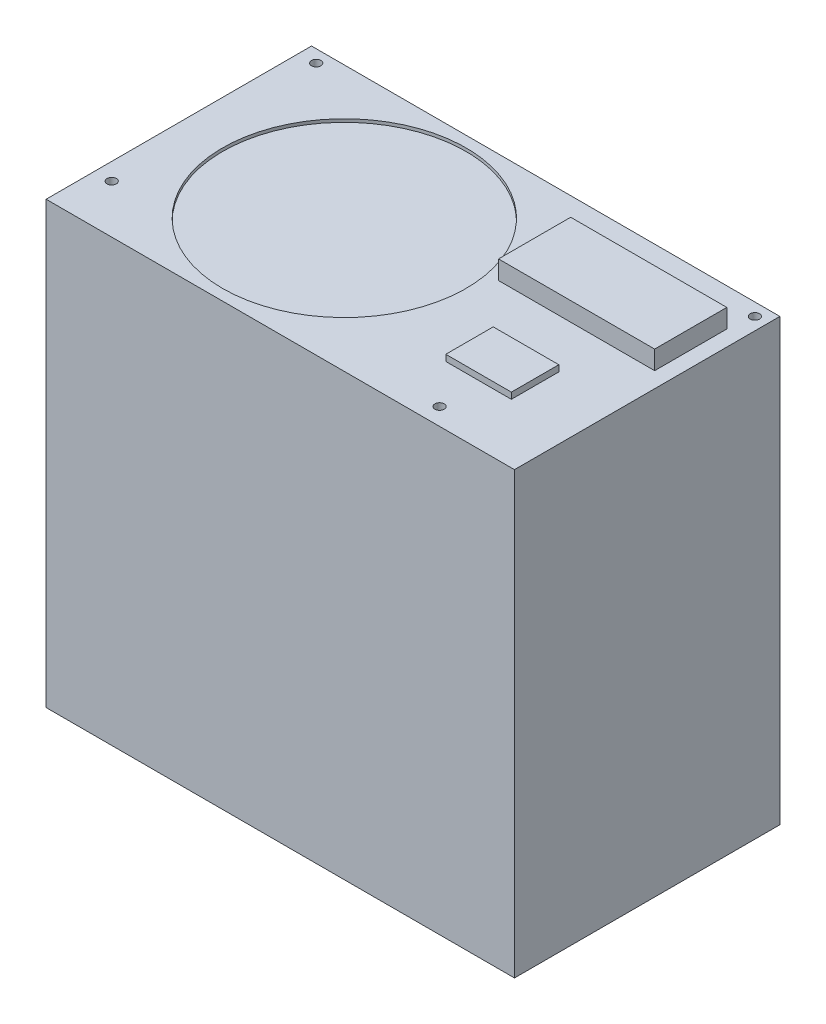
ISO-10303-21;
HEADER;
FILE_DESCRIPTION(('STEP AP214'),'2;1');
FILE_NAME('part.step','',(''),(''),'','','');
FILE_SCHEMA(('AUTOMOTIVE_DESIGN { 1 0 10303 214 1 1 1 1 }'));
ENDSEC;
DATA;
#1=APPLICATION_CONTEXT('core data for automotive mechanical design processes');
#2=APPLICATION_PROTOCOL_DEFINITION('international standard','automotive_design',2000,#1);
#3=PRODUCT_CONTEXT('',#1,'mechanical');
#4=PRODUCT('Part','Part','',(#3));
#5=PRODUCT_RELATED_PRODUCT_CATEGORY('part','',(#4));
#6=PRODUCT_DEFINITION_FORMATION('','',#4);
#7=PRODUCT_DEFINITION_CONTEXT('part definition',#1,'design');
#8=PRODUCT_DEFINITION('design','',#6,#7);
#9=PRODUCT_DEFINITION_SHAPE('','',#8);
#10=(LENGTH_UNIT() NAMED_UNIT(*) SI_UNIT(.MILLI.,.METRE.));
#11=(NAMED_UNIT(*) PLANE_ANGLE_UNIT() SI_UNIT($,.RADIAN.));
#12=(NAMED_UNIT(*) SI_UNIT($,.STERADIAN.) SOLID_ANGLE_UNIT());
#13=UNCERTAINTY_MEASURE_WITH_UNIT(LENGTH_MEASURE(1.E-05),#10,'distance_accuracy_value','');
#14=(GEOMETRIC_REPRESENTATION_CONTEXT(3) GLOBAL_UNCERTAINTY_ASSIGNED_CONTEXT((#13)) GLOBAL_UNIT_ASSIGNED_CONTEXT((#10,
#11,#12)) REPRESENTATION_CONTEXT('',''));
#15=CARTESIAN_POINT('',(0.,0.,0.));
#16=DIRECTION('',(0.,0.,1.));
#17=DIRECTION('',(1.,0.,0.));
#18=AXIS2_PLACEMENT_3D('',#15,#16,#17);
#19=CARTESIAN_POINT('',(0.,141.,85.));
#20=DIRECTION('',(0.,-1.,0.));
#21=DIRECTION('',(0.,0.,-1.));
#22=AXIS2_PLACEMENT_3D('',#19,#20,#21);
#23=PLANE('',#22);
#24=CARTESIAN_POINT('',(120.5,141.,79.5));
#25=DIRECTION('',(0.,1.,0.));
#26=DIRECTION('',(0.,0.,1.));
#27=AXIS2_PLACEMENT_3D('',#24,#25,#26);
#28=CIRCLE('',#27,1.5);
#29=CARTESIAN_POINT('',(120.5,141.,81.));
#30=VERTEX_POINT('',#29);
#31=EDGE_CURVE('E248',#30,#30,#28,.T.);
#32=ORIENTED_EDGE('',*,*,#31,.F.);
#33=EDGE_LOOP('',(#32));
#34=FACE_BOUND('',#33,.T.);
#35=CARTESIAN_POINT('',(5.50000000000001,141.,69.5));
#36=DIRECTION('',(0.,1.,0.));
#37=DIRECTION('',(0.,0.,1.));
#38=AXIS2_PLACEMENT_3D('',#35,#36,#37);
#39=CIRCLE('',#38,1.5);
#40=CARTESIAN_POINT('',(5.50000000000001,141.,71.));
#41=VERTEX_POINT('',#40);
#42=EDGE_CURVE('E242',#41,#41,#39,.T.);
#43=ORIENTED_EDGE('',*,*,#42,.F.);
#44=EDGE_LOOP('',(#43));
#45=FACE_BOUND('',#44,.T.);
#46=CARTESIAN_POINT('',(5.50000000000001,141.,4.));
#47=DIRECTION('',(0.,1.,0.));
#48=DIRECTION('',(0.,0.,1.));
#49=AXIS2_PLACEMENT_3D('',#46,#47,#48);
#50=CIRCLE('',#49,1.5);
#51=CARTESIAN_POINT('',(5.50000000000001,141.,5.5));
#52=VERTEX_POINT('',#51);
#53=EDGE_CURVE('E236',#52,#52,#50,.T.);
#54=ORIENTED_EDGE('',*,*,#53,.F.);
#55=EDGE_LOOP('',(#54));
#56=FACE_BOUND('',#55,.T.);
#57=CARTESIAN_POINT('',(146.,141.,4.));
#58=DIRECTION('',(0.,1.,0.));
#59=DIRECTION('',(0.,0.,1.));
#60=AXIS2_PLACEMENT_3D('',#57,#58,#59);
#61=CIRCLE('',#60,1.5);
#62=CARTESIAN_POINT('',(146.,141.,5.5));
#63=VERTEX_POINT('',#62);
#64=EDGE_CURVE('E229',#63,#63,#61,.T.);
#65=ORIENTED_EDGE('',*,*,#64,.F.);
#66=EDGE_LOOP('',(#65));
#67=FACE_BOUND('',#66,.T.);
#68=CARTESIAN_POINT('',(53.,141.,42.5));
#69=DIRECTION('',(0.,1.,0.));
#70=DIRECTION('',(0.,0.,1.));
#71=AXIS2_PLACEMENT_3D('',#68,#69,#70);
#72=CIRCLE('',#71,39.);
#73=CARTESIAN_POINT('',(53.,141.,81.5));
#74=VERTEX_POINT('',#73);
#75=EDGE_CURVE('E223',#74,#74,#72,.T.);
#76=ORIENTED_EDGE('',*,*,#75,.F.);
#77=EDGE_LOOP('',(#76));
#78=FACE_BOUND('',#77,.T.);
#79=DIRECTION('',(0.,0.,-1.));
#80=VECTOR('',#79,1.);
#81=CARTESIAN_POINT('',(130.,141.,66.));
#82=LINE('',#81,#80);
#83=CARTESIAN_POINT('',(130.,141.,66.));
#84=VERTEX_POINT('',#83);
#85=CARTESIAN_POINT('',(130.,141.,50.8));
#86=VERTEX_POINT('',#85);
#87=EDGE_CURVE('E184',#84,#86,#82,.T.);
#88=ORIENTED_EDGE('',*,*,#87,.F.);
#89=DIRECTION('',(1.,0.,0.));
#90=VECTOR('',#89,1.);
#91=CARTESIAN_POINT('',(130.,141.,66.));
#92=LINE('',#91,#90);
#93=CARTESIAN_POINT('',(109.,141.,66.));
#94=VERTEX_POINT('',#93);
#95=EDGE_CURVE('E174',#94,#84,#92,.T.);
#96=ORIENTED_EDGE('',*,*,#95,.F.);
#97=DIRECTION('',(0.,0.,1.));
#98=VECTOR('',#97,1.);
#99=CARTESIAN_POINT('',(109.,141.,66.));
#100=LINE('',#99,#98);
#101=CARTESIAN_POINT('',(109.,141.,50.8));
#102=VERTEX_POINT('',#101);
#103=EDGE_CURVE('E178',#102,#94,#100,.T.);
#104=ORIENTED_EDGE('',*,*,#103,.F.);
#105=DIRECTION('',(-1.,0.,0.));
#106=VECTOR('',#105,1.);
#107=CARTESIAN_POINT('',(130.,141.,50.8));
#108=LINE('',#107,#106);
#109=EDGE_CURVE('E181',#86,#102,#108,.T.);
#110=ORIENTED_EDGE('',*,*,#109,.F.);
#111=EDGE_LOOP('',(#88,#96,#104,#110));
#112=FACE_BOUND('',#111,.T.);
#113=DIRECTION('',(-1.,0.,0.));
#114=VECTOR('',#113,1.);
#115=CARTESIAN_POINT('',(0.,141.,0.));
#116=LINE('',#115,#114);
#117=CARTESIAN_POINT('',(150.,141.,0.));
#118=VERTEX_POINT('',#117);
#119=CARTESIAN_POINT('',(0.,141.,0.));
#120=VERTEX_POINT('',#119);
#121=EDGE_CURVE('E148',#118,#120,#116,.T.);
#122=ORIENTED_EDGE('',*,*,#121,.T.);
#123=DIRECTION('',(0.,0.,-1.));
#124=VECTOR('',#123,1.);
#125=CARTESIAN_POINT('',(0.,141.,85.));
#126=LINE('',#125,#124);
#127=CARTESIAN_POINT('',(0.,141.,85.));
#128=VERTEX_POINT('',#127);
#129=EDGE_CURVE('E143',#128,#120,#126,.T.);
#130=ORIENTED_EDGE('',*,*,#129,.F.);
#131=DIRECTION('',(-1.,0.,0.));
#132=VECTOR('',#131,1.);
#133=CARTESIAN_POINT('',(0.,141.,85.));
#134=LINE('',#133,#132);
#135=CARTESIAN_POINT('',(150.,141.,85.));
#136=VERTEX_POINT('',#135);
#137=EDGE_CURVE('E147',#136,#128,#134,.T.);
#138=ORIENTED_EDGE('',*,*,#137,.F.);
#139=DIRECTION('',(0.,0.,-1.));
#140=VECTOR('',#139,1.);
#141=CARTESIAN_POINT('',(150.,141.,85.));
#142=LINE('',#141,#140);
#143=EDGE_CURVE('E138',#136,#118,#142,.T.);
#144=ORIENTED_EDGE('',*,*,#143,.T.);
#145=EDGE_LOOP('',(#122,#130,#138,#144));
#146=FACE_BOUND('',#145,.T.);
#147=DIRECTION('',(0.,0.,-1.));
#148=VECTOR('',#147,1.);
#149=CARTESIAN_POINT('',(145.,141.,35.11));
#150=LINE('',#149,#148);
#151=CARTESIAN_POINT('',(145.,141.,35.11));
#152=VERTEX_POINT('',#151);
#153=CARTESIAN_POINT('',(145.,141.,12.));
#154=VERTEX_POINT('',#153);
#155=EDGE_CURVE('E212',#152,#154,#150,.T.);
#156=ORIENTED_EDGE('',*,*,#155,.F.);
#157=DIRECTION('',(1.,0.,0.));
#158=VECTOR('',#157,1.);
#159=CARTESIAN_POINT('',(145.,141.,35.11));
#160=LINE('',#159,#158);
#161=CARTESIAN_POINT('',(95.,141.,35.11));
#162=VERTEX_POINT('',#161);
#163=EDGE_CURVE('E206',#162,#152,#160,.T.);
#164=ORIENTED_EDGE('',*,*,#163,.F.);
#165=DIRECTION('',(0.,0.,1.));
#166=VECTOR('',#165,1.);
#167=CARTESIAN_POINT('',(95.,141.,35.11));
#168=LINE('',#167,#166);
#169=CARTESIAN_POINT('',(95.,141.,12.));
#170=VERTEX_POINT('',#169);
#171=EDGE_CURVE('E53',#170,#162,#168,.T.);
#172=ORIENTED_EDGE('',*,*,#171,.F.);
#173=DIRECTION('',(-1.,0.,0.));
#174=VECTOR('',#173,1.);
#175=CARTESIAN_POINT('',(145.,141.,12.));
#176=LINE('',#175,#174);
#177=EDGE_CURVE('E48',#154,#170,#176,.T.);
#178=ORIENTED_EDGE('',*,*,#177,.F.);
#179=EDGE_LOOP('',(#156,#164,#172,#178));
#180=FACE_BOUND('',#179,.T.);
#181=ADVANCED_FACE('F33',(#34,#45,#56,#67,#78,#112,#146,#180),#23,.F.);
#182=CARTESIAN_POINT('',(0.,0.,85.));
#183=DIRECTION('',(1.,0.,0.));
#184=DIRECTION('',(0.,0.,-1.));
#185=AXIS2_PLACEMENT_3D('',#182,#183,#184);
#186=PLANE('',#185);
#187=DIRECTION('',(0.,-1.,0.));
#188=VECTOR('',#187,1.);
#189=CARTESIAN_POINT('',(0.,0.,0.));
#190=LINE('',#189,#188);
#191=CARTESIAN_POINT('',(0.,0.,0.));
#192=VERTEX_POINT('',#191);
#193=EDGE_CURVE('E134',#120,#192,#190,.T.);
#194=ORIENTED_EDGE('',*,*,#193,.T.);
#195=DIRECTION('',(0.,0.,-1.));
#196=VECTOR('',#195,1.);
#197=CARTESIAN_POINT('',(0.,0.,85.));
#198=LINE('',#197,#196);
#199=CARTESIAN_POINT('',(0.,0.,18.5));
#200=VERTEX_POINT('',#199);
#201=EDGE_CURVE('E41',#200,#192,#198,.T.);
#202=ORIENTED_EDGE('',*,*,#201,.F.);
#203=CARTESIAN_POINT('',(0.,0.,85.));
#204=VERTEX_POINT('',#203);
#205=EDGE_CURVE('E11',#204,#200,#198,.T.);
#206=ORIENTED_EDGE('',*,*,#205,.F.);
#207=DIRECTION('',(0.,-1.,0.));
#208=VECTOR('',#207,1.);
#209=CARTESIAN_POINT('',(0.,0.,85.));
#210=LINE('',#209,#208);
#211=EDGE_CURVE('E150',#128,#204,#210,.T.);
#212=ORIENTED_EDGE('',*,*,#211,.F.);
#213=ORIENTED_EDGE('',*,*,#129,.T.);
#214=EDGE_LOOP('',(#194,#202,#206,#212,#213));
#215=FACE_BOUND('',#214,.T.);
#216=ADVANCED_FACE('F35',(#215),#186,.F.);
#217=CARTESIAN_POINT('',(0.,0.,85.));
#218=DIRECTION('',(0.,1.,0.));
#219=DIRECTION('',(0.,0.,1.));
#220=AXIS2_PLACEMENT_3D('',#217,#218,#219);
#221=PLANE('',#220);
#222=ORIENTED_EDGE('',*,*,#205,.T.);
#223=CARTESIAN_POINT('',(12.5,0.,18.5));
#224=DIRECTION('',(0.,-1.,0.));
#225=DIRECTION('',(0.,0.,-1.));
#226=AXIS2_PLACEMENT_3D('',#223,#224,#225);
#227=CIRCLE('',#226,12.5);
#228=EDGE_CURVE('E125',#200,#200,#227,.T.);
#229=ORIENTED_EDGE('',*,*,#228,.F.);
#230=ORIENTED_EDGE('',*,*,#201,.T.);
#231=DIRECTION('',(1.,0.,0.));
#232=VECTOR('',#231,1.);
#233=CARTESIAN_POINT('',(0.,0.,0.));
#234=LINE('',#233,#232);
#235=CARTESIAN_POINT('',(150.,0.,0.));
#236=VERTEX_POINT('',#235);
#237=EDGE_CURVE('E153',#192,#236,#234,.T.);
#238=ORIENTED_EDGE('',*,*,#237,.T.);
#239=DIRECTION('',(0.,0.,-1.));
#240=VECTOR('',#239,1.);
#241=CARTESIAN_POINT('',(150.,0.,85.));
#242=LINE('',#241,#240);
#243=CARTESIAN_POINT('',(150.,0.,85.));
#244=VERTEX_POINT('',#243);
#245=EDGE_CURVE('E136',#244,#236,#242,.T.);
#246=ORIENTED_EDGE('',*,*,#245,.F.);
#247=DIRECTION('',(1.,0.,0.));
#248=VECTOR('',#247,1.);
#249=CARTESIAN_POINT('',(0.,0.,85.));
#250=LINE('',#249,#248);
#251=EDGE_CURVE('E127',#204,#244,#250,.T.);
#252=ORIENTED_EDGE('',*,*,#251,.F.);
#253=EDGE_LOOP('',(#222,#229,#230,#238,#246,#252));
#254=FACE_BOUND('',#253,.T.);
#255=ADVANCED_FACE('F123',(#254),#221,.F.);
#256=CARTESIAN_POINT('',(150.,0.,85.));
#257=DIRECTION('',(-1.,0.,0.));
#258=DIRECTION('',(0.,0.,1.));
#259=AXIS2_PLACEMENT_3D('',#256,#257,#258);
#260=PLANE('',#259);
#261=DIRECTION('',(0.,1.,0.));
#262=VECTOR('',#261,1.);
#263=CARTESIAN_POINT('',(150.,0.,0.));
#264=LINE('',#263,#262);
#265=EDGE_CURVE('E151',#236,#118,#264,.T.);
#266=ORIENTED_EDGE('',*,*,#265,.T.);
#267=ORIENTED_EDGE('',*,*,#143,.F.);
#268=DIRECTION('',(0.,1.,0.));
#269=VECTOR('',#268,1.);
#270=CARTESIAN_POINT('',(150.,0.,85.));
#271=LINE('',#270,#269);
#272=EDGE_CURVE('E158',#244,#136,#271,.T.);
#273=ORIENTED_EDGE('',*,*,#272,.F.);
#274=ORIENTED_EDGE('',*,*,#245,.T.);
#275=EDGE_LOOP('',(#266,#267,#273,#274));
#276=FACE_BOUND('',#275,.T.);
#277=ADVANCED_FACE('F284',(#276),#260,.F.);
#278=CARTESIAN_POINT('',(0.,0.,85.));
#279=DIRECTION('',(0.,0.,-1.));
#280=DIRECTION('',(-1.,0.,0.));
#281=AXIS2_PLACEMENT_3D('',#278,#279,#280);
#282=PLANE('',#281);
#283=ORIENTED_EDGE('',*,*,#211,.T.);
#284=ORIENTED_EDGE('',*,*,#251,.T.);
#285=ORIENTED_EDGE('',*,*,#272,.T.);
#286=ORIENTED_EDGE('',*,*,#137,.T.);
#287=EDGE_LOOP('',(#283,#284,#285,#286));
#288=FACE_BOUND('',#287,.T.);
#289=ADVANCED_FACE('F286',(#288),#282,.F.);
#290=CARTESIAN_POINT('',(0.,0.,0.));
#291=DIRECTION('',(0.,0.,-1.));
#292=DIRECTION('',(-1.,0.,0.));
#293=AXIS2_PLACEMENT_3D('',#290,#291,#292);
#294=PLANE('',#293);
#295=ORIENTED_EDGE('',*,*,#193,.F.);
#296=ORIENTED_EDGE('',*,*,#121,.F.);
#297=ORIENTED_EDGE('',*,*,#265,.F.);
#298=ORIENTED_EDGE('',*,*,#237,.F.);
#299=EDGE_LOOP('',(#295,#296,#297,#298));
#300=FACE_BOUND('',#299,.T.);
#301=ADVANCED_FACE('F282',(#300),#294,.T.);
#302=CARTESIAN_POINT('',(130.,143.,66.));
#303=DIRECTION('',(-1.,0.,0.));
#304=DIRECTION('',(0.,0.,1.));
#305=AXIS2_PLACEMENT_3D('',#302,#303,#304);
#306=PLANE('',#305);
#307=ORIENTED_EDGE('',*,*,#87,.T.);
#308=DIRECTION('',(0.,-1.,0.));
#309=VECTOR('',#308,1.);
#310=CARTESIAN_POINT('',(130.,143.,50.8));
#311=LINE('',#310,#309);
#312=CARTESIAN_POINT('',(130.,143.,50.8));
#313=VERTEX_POINT('',#312);
#314=EDGE_CURVE('E156',#313,#86,#311,.T.);
#315=ORIENTED_EDGE('',*,*,#314,.F.);
#316=DIRECTION('',(0.,0.,-1.));
#317=VECTOR('',#316,1.);
#318=CARTESIAN_POINT('',(130.,143.,66.));
#319=LINE('',#318,#317);
#320=CARTESIAN_POINT('',(130.,143.,66.));
#321=VERTEX_POINT('',#320);
#322=EDGE_CURVE('E177',#321,#313,#319,.T.);
#323=ORIENTED_EDGE('',*,*,#322,.F.);
#324=DIRECTION('',(0.,-1.,0.));
#325=VECTOR('',#324,1.);
#326=CARTESIAN_POINT('',(130.,143.,66.));
#327=LINE('',#326,#325);
#328=EDGE_CURVE('E170',#321,#84,#327,.T.);
#329=ORIENTED_EDGE('',*,*,#328,.T.);
#330=EDGE_LOOP('',(#307,#315,#323,#329));
#331=FACE_BOUND('',#330,.T.);
#332=ADVANCED_FACE('F308',(#331),#306,.F.);
#333=CARTESIAN_POINT('',(130.,143.,50.8));
#334=DIRECTION('',(0.,0.,1.));
#335=DIRECTION('',(1.,0.,0.));
#336=AXIS2_PLACEMENT_3D('',#333,#334,#335);
#337=PLANE('',#336);
#338=ORIENTED_EDGE('',*,*,#109,.T.);
#339=DIRECTION('',(0.,-1.,0.));
#340=VECTOR('',#339,1.);
#341=CARTESIAN_POINT('',(109.,143.,50.8));
#342=LINE('',#341,#340);
#343=CARTESIAN_POINT('',(109.,143.,50.8));
#344=VERTEX_POINT('',#343);
#345=EDGE_CURVE('E164',#344,#102,#342,.T.);
#346=ORIENTED_EDGE('',*,*,#345,.F.);
#347=DIRECTION('',(-1.,0.,0.));
#348=VECTOR('',#347,1.);
#349=CARTESIAN_POINT('',(130.,143.,50.8));
#350=LINE('',#349,#348);
#351=EDGE_CURVE('E191',#313,#344,#350,.T.);
#352=ORIENTED_EDGE('',*,*,#351,.F.);
#353=ORIENTED_EDGE('',*,*,#314,.T.);
#354=EDGE_LOOP('',(#338,#346,#352,#353));
#355=FACE_BOUND('',#354,.T.);
#356=ADVANCED_FACE('F315',(#355),#337,.F.);
#357=CARTESIAN_POINT('',(109.,143.,66.));
#358=DIRECTION('',(1.,0.,0.));
#359=DIRECTION('',(0.,0.,-1.));
#360=AXIS2_PLACEMENT_3D('',#357,#358,#359);
#361=PLANE('',#360);
#362=ORIENTED_EDGE('',*,*,#103,.T.);
#363=DIRECTION('',(0.,-1.,0.));
#364=VECTOR('',#363,1.);
#365=CARTESIAN_POINT('',(109.,143.,66.));
#366=LINE('',#365,#364);
#367=CARTESIAN_POINT('',(109.,143.,66.));
#368=VERTEX_POINT('',#367);
#369=EDGE_CURVE('E167',#368,#94,#366,.T.);
#370=ORIENTED_EDGE('',*,*,#369,.F.);
#371=DIRECTION('',(0.,0.,1.));
#372=VECTOR('',#371,1.);
#373=CARTESIAN_POINT('',(109.,143.,66.));
#374=LINE('',#373,#372);
#375=EDGE_CURVE('E189',#344,#368,#374,.T.);
#376=ORIENTED_EDGE('',*,*,#375,.F.);
#377=ORIENTED_EDGE('',*,*,#345,.T.);
#378=EDGE_LOOP('',(#362,#370,#376,#377));
#379=FACE_BOUND('',#378,.T.);
#380=ADVANCED_FACE('F323',(#379),#361,.F.);
#381=CARTESIAN_POINT('',(130.,143.,66.));
#382=DIRECTION('',(0.,0.,-1.));
#383=DIRECTION('',(-1.,0.,0.));
#384=AXIS2_PLACEMENT_3D('',#381,#382,#383);
#385=PLANE('',#384);
#386=ORIENTED_EDGE('',*,*,#95,.T.);
#387=ORIENTED_EDGE('',*,*,#328,.F.);
#388=DIRECTION('',(1.,0.,0.));
#389=VECTOR('',#388,1.);
#390=CARTESIAN_POINT('',(130.,143.,66.));
#391=LINE('',#390,#389);
#392=EDGE_CURVE('E173',#368,#321,#391,.T.);
#393=ORIENTED_EDGE('',*,*,#392,.F.);
#394=ORIENTED_EDGE('',*,*,#369,.T.);
#395=EDGE_LOOP('',(#386,#387,#393,#394));
#396=FACE_BOUND('',#395,.T.);
#397=ADVANCED_FACE('F331',(#396),#385,.F.);
#398=CARTESIAN_POINT('',(0.,143.,0.));
#399=DIRECTION('',(0.,1.,0.));
#400=DIRECTION('',(0.,0.,1.));
#401=AXIS2_PLACEMENT_3D('',#398,#399,#400);
#402=PLANE('',#401);
#403=ORIENTED_EDGE('',*,*,#322,.T.);
#404=ORIENTED_EDGE('',*,*,#351,.T.);
#405=ORIENTED_EDGE('',*,*,#375,.T.);
#406=ORIENTED_EDGE('',*,*,#392,.T.);
#407=EDGE_LOOP('',(#403,#404,#405,#406));
#408=FACE_BOUND('',#407,.T.);
#409=ADVANCED_FACE('F339',(#408),#402,.T.);
#410=CARTESIAN_POINT('',(145.,147.,35.11));
#411=DIRECTION('',(-1.,0.,0.));
#412=DIRECTION('',(0.,0.,1.));
#413=AXIS2_PLACEMENT_3D('',#410,#411,#412);
#414=PLANE('',#413);
#415=ORIENTED_EDGE('',*,*,#155,.T.);
#416=DIRECTION('',(0.,-1.,0.));
#417=VECTOR('',#416,1.);
#418=CARTESIAN_POINT('',(145.,147.,12.));
#419=LINE('',#418,#417);
#420=CARTESIAN_POINT('',(145.,147.,12.));
#421=VERTEX_POINT('',#420);
#422=EDGE_CURVE('E187',#421,#154,#419,.T.);
#423=ORIENTED_EDGE('',*,*,#422,.F.);
#424=DIRECTION('',(0.,0.,-1.));
#425=VECTOR('',#424,1.);
#426=CARTESIAN_POINT('',(145.,147.,35.11));
#427=LINE('',#426,#425);
#428=CARTESIAN_POINT('',(145.,147.,35.11));
#429=VERTEX_POINT('',#428);
#430=EDGE_CURVE('E209',#429,#421,#427,.T.);
#431=ORIENTED_EDGE('',*,*,#430,.F.);
#432=DIRECTION('',(0.,-1.,0.));
#433=VECTOR('',#432,1.);
#434=CARTESIAN_POINT('',(145.,147.,35.11));
#435=LINE('',#434,#433);
#436=EDGE_CURVE('E202',#429,#152,#435,.T.);
#437=ORIENTED_EDGE('',*,*,#436,.T.);
#438=EDGE_LOOP('',(#415,#423,#431,#437));
#439=FACE_BOUND('',#438,.T.);
#440=ADVANCED_FACE('F347',(#439),#414,.F.);
#441=CARTESIAN_POINT('',(145.,147.,12.));
#442=DIRECTION('',(0.,0.,1.));
#443=DIRECTION('',(1.,0.,0.));
#444=AXIS2_PLACEMENT_3D('',#441,#442,#443);
#445=PLANE('',#444);
#446=ORIENTED_EDGE('',*,*,#177,.T.);
#447=DIRECTION('',(0.,-1.,0.));
#448=VECTOR('',#447,1.);
#449=CARTESIAN_POINT('',(95.,147.,12.));
#450=LINE('',#449,#448);
#451=CARTESIAN_POINT('',(95.,147.,12.));
#452=VERTEX_POINT('',#451);
#453=EDGE_CURVE('E196',#452,#170,#450,.T.);
#454=ORIENTED_EDGE('',*,*,#453,.F.);
#455=DIRECTION('',(-1.,0.,0.));
#456=VECTOR('',#455,1.);
#457=CARTESIAN_POINT('',(145.,147.,12.));
#458=LINE('',#457,#456);
#459=EDGE_CURVE('E219',#421,#452,#458,.T.);
#460=ORIENTED_EDGE('',*,*,#459,.F.);
#461=ORIENTED_EDGE('',*,*,#422,.T.);
#462=EDGE_LOOP('',(#446,#454,#460,#461));
#463=FACE_BOUND('',#462,.T.);
#464=ADVANCED_FACE('F355',(#463),#445,.F.);
#465=CARTESIAN_POINT('',(95.,147.,35.11));
#466=DIRECTION('',(1.,0.,0.));
#467=DIRECTION('',(0.,0.,-1.));
#468=AXIS2_PLACEMENT_3D('',#465,#466,#467);
#469=PLANE('',#468);
#470=ORIENTED_EDGE('',*,*,#171,.T.);
#471=DIRECTION('',(0.,-1.,0.));
#472=VECTOR('',#471,1.);
#473=CARTESIAN_POINT('',(95.,147.,35.11));
#474=LINE('',#473,#472);
#475=CARTESIAN_POINT('',(95.,147.,35.11));
#476=VERTEX_POINT('',#475);
#477=EDGE_CURVE('E199',#476,#162,#474,.T.);
#478=ORIENTED_EDGE('',*,*,#477,.F.);
#479=DIRECTION('',(0.,0.,1.));
#480=VECTOR('',#479,1.);
#481=CARTESIAN_POINT('',(95.,147.,35.11));
#482=LINE('',#481,#480);
#483=EDGE_CURVE('E217',#452,#476,#482,.T.);
#484=ORIENTED_EDGE('',*,*,#483,.F.);
#485=ORIENTED_EDGE('',*,*,#453,.T.);
#486=EDGE_LOOP('',(#470,#478,#484,#485));
#487=FACE_BOUND('',#486,.T.);
#488=ADVANCED_FACE('F363',(#487),#469,.F.);
#489=CARTESIAN_POINT('',(145.,147.,35.11));
#490=DIRECTION('',(0.,0.,-1.));
#491=DIRECTION('',(-1.,0.,0.));
#492=AXIS2_PLACEMENT_3D('',#489,#490,#491);
#493=PLANE('',#492);
#494=ORIENTED_EDGE('',*,*,#163,.T.);
#495=ORIENTED_EDGE('',*,*,#436,.F.);
#496=DIRECTION('',(1.,0.,0.));
#497=VECTOR('',#496,1.);
#498=CARTESIAN_POINT('',(145.,147.,35.11));
#499=LINE('',#498,#497);
#500=EDGE_CURVE('E205',#476,#429,#499,.T.);
#501=ORIENTED_EDGE('',*,*,#500,.F.);
#502=ORIENTED_EDGE('',*,*,#477,.T.);
#503=EDGE_LOOP('',(#494,#495,#501,#502));
#504=FACE_BOUND('',#503,.T.);
#505=ADVANCED_FACE('F371',(#504),#493,.F.);
#506=CARTESIAN_POINT('',(0.,147.,0.));
#507=DIRECTION('',(0.,1.,0.));
#508=DIRECTION('',(0.,0.,1.));
#509=AXIS2_PLACEMENT_3D('',#506,#507,#508);
#510=PLANE('',#509);
#511=ORIENTED_EDGE('',*,*,#430,.T.);
#512=ORIENTED_EDGE('',*,*,#459,.T.);
#513=ORIENTED_EDGE('',*,*,#483,.T.);
#514=ORIENTED_EDGE('',*,*,#500,.T.);
#515=EDGE_LOOP('',(#511,#512,#513,#514));
#516=FACE_BOUND('',#515,.T.);
#517=ADVANCED_FACE('F379',(#516),#510,.T.);
#518=CARTESIAN_POINT('',(53.,140.,42.5));
#519=DIRECTION('',(0.,1.,0.));
#520=DIRECTION('',(0.,0.,1.));
#521=AXIS2_PLACEMENT_3D('',#518,#519,#520);
#522=CYLINDRICAL_SURFACE('',#521,39.);
#523=CARTESIAN_POINT('',(53.,140.,42.5));
#524=DIRECTION('',(0.,1.,0.));
#525=DIRECTION('',(0.,0.,1.));
#526=AXIS2_PLACEMENT_3D('',#523,#524,#525);
#527=CIRCLE('',#526,39.);
#528=CARTESIAN_POINT('',(53.,140.,81.5));
#529=VERTEX_POINT('',#528);
#530=EDGE_CURVE('E215',#529,#529,#527,.T.);
#531=ORIENTED_EDGE('',*,*,#530,.F.);
#532=EDGE_LOOP('',(#531));
#533=FACE_BOUND('',#532,.T.);
#534=ORIENTED_EDGE('',*,*,#75,.T.);
#535=EDGE_LOOP('',(#534));
#536=FACE_BOUND('',#535,.T.);
#537=ADVANCED_FACE('F387',(#533,#536),#522,.F.);
#538=CARTESIAN_POINT('',(53.,140.,42.5));
#539=DIRECTION('',(0.,1.,0.));
#540=DIRECTION('',(0.,0.,1.));
#541=AXIS2_PLACEMENT_3D('',#538,#539,#540);
#542=PLANE('',#541);
#543=ORIENTED_EDGE('',*,*,#530,.T.);
#544=EDGE_LOOP('',(#543));
#545=FACE_BOUND('',#544,.T.);
#546=ADVANCED_FACE('F395',(#545),#542,.T.);
#547=CARTESIAN_POINT('',(146.,136.,4.));
#548=DIRECTION('',(0.,1.,0.));
#549=DIRECTION('',(0.,0.,1.));
#550=AXIS2_PLACEMENT_3D('',#547,#548,#549);
#551=CYLINDRICAL_SURFACE('',#550,1.5);
#552=CARTESIAN_POINT('',(146.,136.,4.));
#553=DIRECTION('',(0.,1.,0.));
#554=DIRECTION('',(0.,0.,1.));
#555=AXIS2_PLACEMENT_3D('',#552,#553,#554);
#556=CIRCLE('',#555,1.5);
#557=CARTESIAN_POINT('',(146.,136.,5.5));
#558=VERTEX_POINT('',#557);
#559=EDGE_CURVE('E232',#558,#558,#556,.T.);
#560=ORIENTED_EDGE('',*,*,#559,.F.);
#561=EDGE_LOOP('',(#560));
#562=FACE_BOUND('',#561,.T.);
#563=ORIENTED_EDGE('',*,*,#64,.T.);
#564=EDGE_LOOP('',(#563));
#565=FACE_BOUND('',#564,.T.);
#566=ADVANCED_FACE('F403',(#562,#565),#551,.F.);
#567=CARTESIAN_POINT('',(146.,136.,4.));
#568=DIRECTION('',(0.,1.,0.));
#569=DIRECTION('',(0.,0.,1.));
#570=AXIS2_PLACEMENT_3D('',#567,#568,#569);
#571=PLANE('',#570);
#572=ORIENTED_EDGE('',*,*,#559,.T.);
#573=EDGE_LOOP('',(#572));
#574=FACE_BOUND('',#573,.T.);
#575=ADVANCED_FACE('F411',(#574),#571,.T.);
#576=CARTESIAN_POINT('',(5.50000000000001,136.,4.));
#577=DIRECTION('',(0.,1.,0.));
#578=DIRECTION('',(0.,0.,1.));
#579=AXIS2_PLACEMENT_3D('',#576,#577,#578);
#580=CYLINDRICAL_SURFACE('',#579,1.5);
#581=CARTESIAN_POINT('',(5.50000000000001,136.,4.));
#582=DIRECTION('',(0.,1.,0.));
#583=DIRECTION('',(0.,0.,1.));
#584=AXIS2_PLACEMENT_3D('',#581,#582,#583);
#585=CIRCLE('',#584,1.5);
#586=CARTESIAN_POINT('',(5.50000000000001,136.,5.5));
#587=VERTEX_POINT('',#586);
#588=EDGE_CURVE('E239',#587,#587,#585,.T.);
#589=ORIENTED_EDGE('',*,*,#588,.F.);
#590=EDGE_LOOP('',(#589));
#591=FACE_BOUND('',#590,.T.);
#592=ORIENTED_EDGE('',*,*,#53,.T.);
#593=EDGE_LOOP('',(#592));
#594=FACE_BOUND('',#593,.T.);
#595=ADVANCED_FACE('F419',(#591,#594),#580,.F.);
#596=CARTESIAN_POINT('',(5.50000000000001,136.,4.));
#597=DIRECTION('',(0.,1.,0.));
#598=DIRECTION('',(0.,0.,1.));
#599=AXIS2_PLACEMENT_3D('',#596,#597,#598);
#600=PLANE('',#599);
#601=ORIENTED_EDGE('',*,*,#588,.T.);
#602=EDGE_LOOP('',(#601));
#603=FACE_BOUND('',#602,.T.);
#604=ADVANCED_FACE('F427',(#603),#600,.T.);
#605=CARTESIAN_POINT('',(5.50000000000001,136.,69.5));
#606=DIRECTION('',(0.,1.,0.));
#607=DIRECTION('',(0.,0.,1.));
#608=AXIS2_PLACEMENT_3D('',#605,#606,#607);
#609=CYLINDRICAL_SURFACE('',#608,1.5);
#610=CARTESIAN_POINT('',(5.50000000000001,136.,69.5));
#611=DIRECTION('',(0.,1.,0.));
#612=DIRECTION('',(0.,0.,1.));
#613=AXIS2_PLACEMENT_3D('',#610,#611,#612);
#614=CIRCLE('',#613,1.5);
#615=CARTESIAN_POINT('',(5.50000000000001,136.,71.));
#616=VERTEX_POINT('',#615);
#617=EDGE_CURVE('E245',#616,#616,#614,.T.);
#618=ORIENTED_EDGE('',*,*,#617,.F.);
#619=EDGE_LOOP('',(#618));
#620=FACE_BOUND('',#619,.T.);
#621=ORIENTED_EDGE('',*,*,#42,.T.);
#622=EDGE_LOOP('',(#621));
#623=FACE_BOUND('',#622,.T.);
#624=ADVANCED_FACE('F435',(#620,#623),#609,.F.);
#625=CARTESIAN_POINT('',(5.50000000000001,136.,69.5));
#626=DIRECTION('',(0.,1.,0.));
#627=DIRECTION('',(0.,0.,1.));
#628=AXIS2_PLACEMENT_3D('',#625,#626,#627);
#629=PLANE('',#628);
#630=ORIENTED_EDGE('',*,*,#617,.T.);
#631=EDGE_LOOP('',(#630));
#632=FACE_BOUND('',#631,.T.);
#633=ADVANCED_FACE('F443',(#632),#629,.T.);
#634=CARTESIAN_POINT('',(120.5,136.,79.5));
#635=DIRECTION('',(0.,1.,0.));
#636=DIRECTION('',(0.,0.,1.));
#637=AXIS2_PLACEMENT_3D('',#634,#635,#636);
#638=CYLINDRICAL_SURFACE('',#637,1.5);
#639=CARTESIAN_POINT('',(120.5,136.,79.5));
#640=DIRECTION('',(0.,1.,0.));
#641=DIRECTION('',(0.,0.,1.));
#642=AXIS2_PLACEMENT_3D('',#639,#640,#641);
#643=CIRCLE('',#642,1.5);
#644=CARTESIAN_POINT('',(120.5,136.,81.));
#645=VERTEX_POINT('',#644);
#646=EDGE_CURVE('E226',#645,#645,#643,.T.);
#647=ORIENTED_EDGE('',*,*,#646,.F.);
#648=EDGE_LOOP('',(#647));
#649=FACE_BOUND('',#648,.T.);
#650=ORIENTED_EDGE('',*,*,#31,.T.);
#651=EDGE_LOOP('',(#650));
#652=FACE_BOUND('',#651,.T.);
#653=ADVANCED_FACE('F269',(#649,#652),#638,.F.);
#654=CARTESIAN_POINT('',(120.5,136.,79.5));
#655=DIRECTION('',(0.,1.,0.));
#656=DIRECTION('',(0.,0.,1.));
#657=AXIS2_PLACEMENT_3D('',#654,#655,#656);
#658=PLANE('',#657);
#659=ORIENTED_EDGE('',*,*,#646,.T.);
#660=EDGE_LOOP('',(#659));
#661=FACE_BOUND('',#660,.T.);
#662=ADVANCED_FACE('F262',(#661),#658,.T.);
#663=CARTESIAN_POINT('',(12.5,-5.,18.5));
#664=DIRECTION('',(0.,1.,0.));
#665=DIRECTION('',(0.,0.,1.));
#666=AXIS2_PLACEMENT_3D('',#663,#664,#665);
#667=CYLINDRICAL_SURFACE('',#666,12.5);
#668=CARTESIAN_POINT('',(12.5,-5.,18.5));
#669=DIRECTION('',(0.,-1.,0.));
#670=DIRECTION('',(0.,0.,-1.));
#671=AXIS2_PLACEMENT_3D('',#668,#669,#670);
#672=CIRCLE('',#671,12.5);
#673=CARTESIAN_POINT('',(12.5,-5.,6.));
#674=VERTEX_POINT('',#673);
#675=EDGE_CURVE('E233',#674,#674,#672,.T.);
#676=ORIENTED_EDGE('',*,*,#675,.F.);
#677=EDGE_LOOP('',(#676));
#678=FACE_BOUND('',#677,.T.);
#679=ORIENTED_EDGE('',*,*,#228,.T.);
#680=EDGE_LOOP('',(#679));
#681=FACE_BOUND('',#680,.T.);
#682=ADVANCED_FACE('F259',(#678,#681),#667,.T.);
#683=CARTESIAN_POINT('',(12.5,-5.,18.5));
#684=DIRECTION('',(0.,-1.,0.));
#685=DIRECTION('',(0.,0.,-1.));
#686=AXIS2_PLACEMENT_3D('',#683,#684,#685);
#687=PLANE('',#686);
#688=ORIENTED_EDGE('',*,*,#675,.T.);
#689=EDGE_LOOP('',(#688));
#690=FACE_BOUND('',#689,.T.);
#691=ADVANCED_FACE('F257',(#690),#687,.T.);
#692=CLOSED_SHELL('',(#181,#216,#255,#277,#289,#301,#332,#356,#380,#397,#409,#440,#464,#488,
#505,#517,#537,#546,#566,#575,#595,#604,#624,#633,#653,#662,#682,#691));
#693=MANIFOLD_SOLID_BREP('B2',#692);
#694=ADVANCED_BREP_SHAPE_REPRESENTATION('',(#18,#693),#14);
#695=SHAPE_DEFINITION_REPRESENTATION(#9,#694);
ENDSEC;
END-ISO-10303-21;
